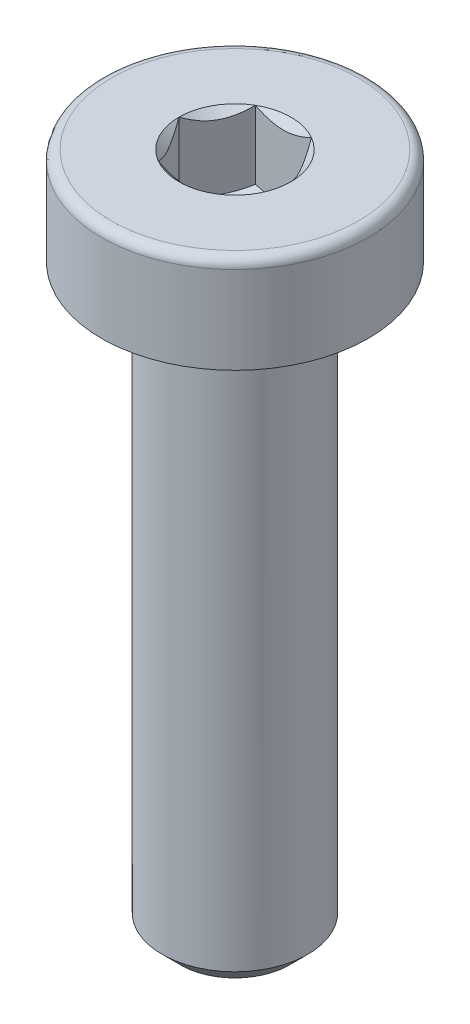
ISO-10303-21;
HEADER;
FILE_DESCRIPTION(('STEP AP214'),'2;1');
FILE_NAME('part.step','',(''),(''),'','','');
FILE_SCHEMA(('AUTOMOTIVE_DESIGN { 1 0 10303 214 1 1 1 1 }'));
ENDSEC;
DATA;
#1=APPLICATION_CONTEXT('core data for automotive mechanical design processes');
#2=APPLICATION_PROTOCOL_DEFINITION('international standard','automotive_design',2000,#1);
#3=PRODUCT_CONTEXT('',#1,'mechanical');
#4=PRODUCT('Part','Part','',(#3));
#5=PRODUCT_RELATED_PRODUCT_CATEGORY('part','',(#4));
#6=PRODUCT_DEFINITION_FORMATION('','',#4);
#7=PRODUCT_DEFINITION_CONTEXT('part definition',#1,'design');
#8=PRODUCT_DEFINITION('design','',#6,#7);
#9=PRODUCT_DEFINITION_SHAPE('','',#8);
#10=(LENGTH_UNIT() NAMED_UNIT(*) SI_UNIT(.MILLI.,.METRE.));
#11=(NAMED_UNIT(*) PLANE_ANGLE_UNIT() SI_UNIT($,.RADIAN.));
#12=(NAMED_UNIT(*) SI_UNIT($,.STERADIAN.) SOLID_ANGLE_UNIT());
#13=UNCERTAINTY_MEASURE_WITH_UNIT(LENGTH_MEASURE(1.E-05),#10,'distance_accuracy_value','');
#14=(GEOMETRIC_REPRESENTATION_CONTEXT(3) GLOBAL_UNCERTAINTY_ASSIGNED_CONTEXT((#13)) GLOBAL_UNIT_ASSIGNED_CONTEXT((#10,
#11,#12)) REPRESENTATION_CONTEXT('',''));
#15=CARTESIAN_POINT('',(0.,0.,0.));
#16=DIRECTION('',(0.,0.,1.));
#17=DIRECTION('',(1.,0.,0.));
#18=AXIS2_PLACEMENT_3D('',#15,#16,#17);
#19=CARTESIAN_POINT('',(0.,-0.2,0.));
#20=DIRECTION('',(0.,1.,0.));
#21=DIRECTION('',(0.,0.,-1.));
#22=AXIS2_PLACEMENT_3D('',#19,#20,#21);
#23=TOROIDAL_SURFACE('',#22,1.7,0.2);
#24=CARTESIAN_POINT('',(0.,0.,0.));
#25=DIRECTION('',(0.,-1.,0.));
#26=DIRECTION('',(0.,0.,-1.));
#27=AXIS2_PLACEMENT_3D('',#24,#25,#26);
#28=CIRCLE('',#27,1.7);
#29=CARTESIAN_POINT('',(0.,0.,-1.7));
#30=VERTEX_POINT('',#29);
#31=EDGE_CURVE('E290',#30,#30,#28,.T.);
#32=ORIENTED_EDGE('',*,*,#31,.T.);
#33=EDGE_LOOP('',(#32));
#34=FACE_BOUND('',#33,.T.);
#35=CARTESIAN_POINT('',(0.,-0.2,0.));
#36=DIRECTION('',(0.,1.,0.));
#37=DIRECTION('',(0.,0.,-1.));
#38=AXIS2_PLACEMENT_3D('',#35,#36,#37);
#39=CIRCLE('',#38,1.5);
#40=CARTESIAN_POINT('',(0.,-0.2,-1.5));
#41=VERTEX_POINT('',#40);
#42=EDGE_CURVE('E300',#41,#41,#39,.T.);
#43=ORIENTED_EDGE('',*,*,#42,.T.);
#44=EDGE_LOOP('',(#43));
#45=FACE_BOUND('',#44,.T.);
#46=ADVANCED_FACE('F41',(#34,#45),#23,.F.);
#47=CARTESIAN_POINT('',(0.,-12.,0.));
#48=DIRECTION('',(0.,1.,0.));
#49=DIRECTION('',(1.,0.,0.));
#50=AXIS2_PLACEMENT_3D('',#47,#48,#49);
#51=PLANE('',#50);
#52=CARTESIAN_POINT('',(0.,-12.,0.));
#53=DIRECTION('',(0.,1.,0.));
#54=DIRECTION('',(0.,0.,-1.));
#55=AXIS2_PLACEMENT_3D('',#52,#53,#54);
#56=CIRCLE('',#55,1.125);
#57=CARTESIAN_POINT('',(0.,-12.,-1.125));
#58=VERTEX_POINT('',#57);
#59=EDGE_CURVE('E11',#58,#58,#56,.T.);
#60=ORIENTED_EDGE('',*,*,#59,.F.);
#61=EDGE_LOOP('',(#60));
#62=FACE_BOUND('',#61,.T.);
#63=ADVANCED_FACE('F316',(#62),#51,.F.);
#64=CARTESIAN_POINT('',(0.,-12.125,0.));
#65=DIRECTION('',(0.,1.,0.));
#66=DIRECTION('',(-1.,0.,0.));
#67=AXIS2_PLACEMENT_3D('',#64,#65,#66);
#68=CONICAL_SURFACE('',#67,1.,0.785398163397448);
#69=ORIENTED_EDGE('',*,*,#59,.T.);
#70=EDGE_LOOP('',(#69));
#71=FACE_BOUND('',#70,.T.);
#72=CARTESIAN_POINT('',(0.,-11.625,0.));
#73=DIRECTION('',(0.,1.,0.));
#74=DIRECTION('',(-1.,0.,0.));
#75=AXIS2_PLACEMENT_3D('',#72,#73,#74);
#76=CIRCLE('',#75,1.5);
#77=CARTESIAN_POINT('',(-1.5,-11.625,0.));
#78=VERTEX_POINT('',#77);
#79=EDGE_CURVE('E133',#78,#78,#76,.T.);
#80=ORIENTED_EDGE('',*,*,#79,.F.);
#81=EDGE_LOOP('',(#80));
#82=FACE_BOUND('',#81,.T.);
#83=ADVANCED_FACE('F271',(#71,#82),#68,.T.);
#84=CARTESIAN_POINT('',(-1.15470053837925,0.5,0.));
#85=DIRECTION('',(-0.866025403784439,0.,-0.5));
#86=DIRECTION('',(0.,1.,0.));
#87=AXIS2_PLACEMENT_3D('',#84,#85,#86);
#88=PLANE('',#87);
#89=CARTESIAN_POINT('',(-1.15470053837925,2.,0.));
#90=CARTESIAN_POINT('',(-1.13811290051949,1.98342266199646,-0.0287348170953944));
#91=CARTESIAN_POINT('',(-1.12123555069305,1.96760439479917,-0.0577616138982867));
#92=CARTESIAN_POINT('',(-1.09593470093621,1.94579754194468,-0.101183953998303));
#93=CARTESIAN_POINT('',(-1.08770744910027,1.93899563963594,-0.115289976780325));
#94=CARTESIAN_POINT('',(-1.07137905760404,1.92611876946348,-0.143289328742409));
#95=CARTESIAN_POINT('',(-1.06328091933733,1.92002869586461,-0.157177412131507));
#96=CARTESIAN_POINT('',(-1.04720018701061,1.90857633773861,-0.184787164277924));
#97=CARTESIAN_POINT('',(-1.03921987610035,1.90319950581573,-0.198504111998951));
#98=CARTESIAN_POINT('',(-1.02335869013404,1.89317259824657,-0.225819419170297));
#99=CARTESIAN_POINT('',(-1.01547945146266,1.88850921181502,-0.239413822772958));
#100=CARTESIAN_POINT('',(-0.999798885932428,1.87990783588392,-0.266532275213475));
#101=CARTESIAN_POINT('',(-0.991998636338617,1.87595850190746,-0.280053335251351));
#102=CARTESIAN_POINT('',(-0.976448412405247,1.86878294697385,-0.307073372510779));
#103=CARTESIAN_POINT('',(-0.968699070566479,1.86554812543175,-0.320570421372709));
#104=CARTESIAN_POINT('',(-0.953216804871379,1.85979880306902,-0.347590357134202));
#105=CARTESIAN_POINT('',(-0.945484180860458,1.85727916970106,-0.361112320660297));
#106=CARTESIAN_POINT('',(-0.929993904585942,1.85295579242638,-0.388228510454098));
#107=CARTESIAN_POINT('',(-0.922236308144873,1.85115096744245,-0.401822595841889));
#108=CARTESIAN_POINT('',(-0.90665050966111,1.8482557150365,-0.429129644754855));
#109=CARTESIAN_POINT('',(-0.898822146976691,1.84716860492423,-0.442842867527506));
#110=CARTESIAN_POINT('',(-0.883030995902152,1.8456940799998,-0.470425755688464));
#111=CARTESIAN_POINT('',(-0.875067667178854,1.84531431420474,-0.484295517782133));
#112=CARTESIAN_POINT('',(-0.858942744760318,1.84528887087763,-0.51231125005588));
#113=CARTESIAN_POINT('',(-0.85078050857397,1.84565882739202,-0.52645688326507));
#114=CARTESIAN_POINT('',(-0.834496812685205,1.847210942197,-0.554713266474792));
#115=CARTESIAN_POINT('',(-0.826375327173013,1.84839249628394,-0.56882403459356));
#116=CARTESIAN_POINT('',(-0.810129363846157,1.85155142789717,-0.597074648783628));
#117=CARTESIAN_POINT('',(-0.802005196148906,1.85353382402747,-0.61121410805965));
#118=CARTESIAN_POINT('',(-0.785713974285288,1.85829144566636,-0.639587165283902));
#119=CARTESIAN_POINT('',(-0.777547766927851,1.86107677968836,-0.653819546505297));
#120=CARTESIAN_POINT('',(-0.761124224940597,1.86743549154836,-0.682436198086551));
#121=CARTESIAN_POINT('',(-0.752868210738168,1.87102315380283,-0.696818032238172));
#122=CARTESIAN_POINT('',(-0.736207806345465,1.87897968869029,-0.725784259598186));
#123=CARTESIAN_POINT('',(-0.727804874211313,1.88336586622526,-0.740364713591029));
#124=CARTESIAN_POINT('',(-0.711592080268563,1.8924866846744,-0.768416307208119));
#125=CARTESIAN_POINT('',(-0.703778742074904,1.89718094197276,-0.781898624581838));
#126=CARTESIAN_POINT('',(-0.688135072813054,1.90717702575227,-0.808872655482011));
#127=CARTESIAN_POINT('',(-0.680305730171417,1.91248565807263,-0.822362416598757));
#128=CARTESIAN_POINT('',(-0.664615689697741,1.92370585705,-0.84938935749767));
#129=CARTESIAN_POINT('',(-0.656756414542127,1.92962555083964,-0.862923982797114));
#130=CARTESIAN_POINT('',(-0.64099605532617,1.94206708289181,-0.890075839755966));
#131=CARTESIAN_POINT('',(-0.633096875640915,1.94859801630983,-0.903689987556145));
#132=CARTESIAN_POINT('',(-0.609052537896968,1.96932150291984,-0.945159941867087));
#133=CARTESIAN_POINT('',(-0.593083085982219,1.98426742536512,-0.972744659363466));
#134=CARTESIAN_POINT('',(-0.577350269189265,1.9999999999997,-0.999999999999873));
#135=B_SPLINE_CURVE_WITH_KNOTS('',3,(#89,#90,#91,#92,#93,#94,#95,#96,#97,#98,#99,#100,#101,#102,
#103,#104,#105,#106,#107,#108,#109,#110,#111,#112,#113,#114,#115,#116,#117,#118,#119,#120,#121,
#122,#123,#124,#125,#126,#127,#128,#129,#130,#131,#132,#133,#134),.UNSPECIFIED.,.F.,.F.,(4,2,2,
2,2,2,2,2,2,2,2,2,2,2,2,2,2,2,2,2,2,2,4),(0.,0.111272550174337,0.164335445361573,
0.215899595557141,0.266155171285321,0.315312848542686,0.363603421261408,0.411276511431237,
0.458598287135888,0.505848217490368,0.553315037999811,0.601292236029578,0.650280199235592,
0.699231732228985,0.748494907961426,0.798407597789335,0.849291872516503,0.90144968589758,
0.950262743745297,0.999680464451618,1.0498706012499,1.10098683352,1.20653128166088),.UNSPECIFIED.);
#136=CARTESIAN_POINT('',(-1.15470053837925,2.,0.));
#137=VERTEX_POINT('',#136);
#138=CARTESIAN_POINT('',(-0.577350269189626,2.,-1.));
#139=VERTEX_POINT('',#138);
#140=EDGE_CURVE('E149',#137,#139,#135,.T.);
#141=ORIENTED_EDGE('',*,*,#140,.F.);
#142=DIRECTION('',(0.,1.,0.));
#143=VECTOR('',#142,1.);
#144=CARTESIAN_POINT('',(-1.15470053837925,0.5,0.));
#145=LINE('',#144,#143);
#146=CARTESIAN_POINT('',(-1.15470053837925,0.589316397477044,0.));
#147=VERTEX_POINT('',#146);
#148=EDGE_CURVE('E53',#147,#137,#145,.T.);
#149=ORIENTED_EDGE('',*,*,#148,.F.);
#150=CARTESIAN_POINT('',(-1.15470053837925,0.589316397477044,0.));
#151=CARTESIAN_POINT('',(-0.866025403784419,0.422649730810363,-0.500000000000031));
#152=CARTESIAN_POINT('',(-0.577350269189623,0.589316397477023,-1.));
#153=B_SPLINE_CURVE_WITH_KNOTS('',2,(#150,#151,#152),.UNSPECIFIED.,.F.,.F.,(3,3),(0.,1.),.UNSPECIFIED.);
#154=CARTESIAN_POINT('',(-0.577350269189626,0.589316397477042,-1.));
#155=VERTEX_POINT('',#154);
#156=EDGE_CURVE('E132',#147,#155,#153,.T.);
#157=ORIENTED_EDGE('',*,*,#156,.T.);
#158=DIRECTION('',(0.,1.,0.));
#159=VECTOR('',#158,1.);
#160=CARTESIAN_POINT('',(-0.577350269189626,0.5,-1.));
#161=LINE('',#160,#159);
#162=EDGE_CURVE('E176',#155,#139,#161,.T.);
#163=ORIENTED_EDGE('',*,*,#162,.T.);
#164=EDGE_LOOP('',(#141,#149,#157,#163));
#165=FACE_BOUND('',#164,.T.);
#166=ADVANCED_FACE('F147',(#165),#88,.F.);
#167=CARTESIAN_POINT('',(-0.577350269189624,0.5,1.));
#168=DIRECTION('',(-0.866025403784438,0.,0.5));
#169=DIRECTION('',(-0.5,0.,-0.866025403784438));
#170=AXIS2_PLACEMENT_3D('',#167,#168,#169);
#171=PLANE('',#170);
#172=CARTESIAN_POINT('',(-0.577350269189628,2.00000000000001,1.));
#173=CARTESIAN_POINT('',(-0.593941531837459,1.98342266199647,0.971267275676974));
#174=CARTESIAN_POINT('',(-0.61064080034603,1.96760439479918,0.942137663577272));
#175=CARTESIAN_POINT('',(-0.635595225085994,1.94579754194469,0.898515314900514));
#176=CARTESIAN_POINT('',(-0.643697773243615,1.93899563963595,0.884337294416245));
#177=CARTESIAN_POINT('',(-0.659781727584165,1.92611876946349,0.856196816596529));
#178=CARTESIAN_POINT('',(-0.667760091475645,1.92002869586462,0.842239581439652));
#179=CARTESIAN_POINT('',(-0.683630472063271,1.90857633773862,0.814508382660042));
#180=CARTESIAN_POINT('',(-0.691519541796937,1.90319950581574,0.800738756821153));
#181=CARTESIAN_POINT('',(-0.70724469873634,1.89317259824658,0.773344913254501));
#182=CARTESIAN_POINT('',(-0.715078178269854,1.88850921181503,0.759724090601278));
#183=CARTESIAN_POINT('',(-0.730723164229545,1.87990783588393,0.732585096286131));
#184=CARTESIAN_POINT('',(-0.738532620911535,1.87595850190747,0.719069351963093));
#185=CARTESIAN_POINT('',(-0.754157547622717,1.86878294697386,0.692092444372544));
#186=CARTESIAN_POINT('',(-0.761971663893885,1.86554812543175,0.678632793046597));
#187=CARTESIAN_POINT('',(-0.77763048182441,1.85979880306903,0.651714789765753));
#188=CARTESIAN_POINT('',(-0.785474533741595,1.85727916970106,0.638257159171334));
#189=CARTESIAN_POINT('',(-0.80121270481961,1.85295579242638,0.611284091509063));
#190=CARTESIAN_POINT('',(-0.809106729886117,1.85115096744246,0.597768773224894));
#191=CARTESIAN_POINT('',(-0.824962428705249,1.84825571503651,0.570617551343206));
#192=CARTESIAN_POINT('',(-0.83292424665191,1.84716860492424,0.556981379002135));
#193=CARTESIAN_POINT('',(-0.848916152971775,1.84569407999981,0.529514396936106));
#194=CARTESIAN_POINT('',(-0.856946054927689,1.84531431420475,0.515683070916208));
#195=CARTESIAN_POINT('',(-0.873145929573069,1.84528887087764,0.487710612330905));
#196=CARTESIAN_POINT('',(-0.881315289191631,1.84565882739203,0.47356909183732));
#197=CARTESIAN_POINT('',(-0.897644186925879,1.84721094219701,0.445338805925414));
#198=CARTESIAN_POINT('',(-0.90580372782753,1.84839249628395,0.431250009096055));
#199=CARTESIAN_POINT('',(-0.922146495725198,1.85155142789717,0.403055285051083));
#200=CARTESIAN_POINT('',(-0.930329542805383,1.85353382402748,0.388949819802669));
#201=CARTESIAN_POINT('',(-0.946755720212819,1.85829144566637,0.360654679197969));
#202=CARTESIAN_POINT('',(-0.954998220228186,1.86107677968837,0.346466345563147));
#203=CARTESIAN_POINT('',(-0.971569196475207,1.86743549154837,0.31793481519138));
#204=CARTESIAN_POINT('',(-0.979896223102333,1.87102315380284,0.303593980082215));
#205=CARTESIAN_POINT('',(-0.996651509651594,1.8789796886903,0.274682532960673));
#206=CARTESIAN_POINT('',(-1.00507708714105,1.88336586622527,0.260115153269712));
#207=CARTESIAN_POINT('',(-1.02126408285868,1.89248668467436,0.232048665040395));
#208=CARTESIAN_POINT('',(-1.02903344310931,1.89718094197267,0.218540956989525));
#209=CARTESIAN_POINT('',(-1.04457180448032,1.90717702575211,0.191506126550374));
#210=CARTESIAN_POINT('',(-1.05233960897755,1.91248565807245,0.177980836369454));
#211=CARTESIAN_POINT('',(-1.06790060614572,1.92370585704978,0.150879392283449));
#212=CARTESIAN_POINT('',(-1.07569229790793,1.92962555083941,0.137305747693652));
#213=CARTESIAN_POINT('',(-1.09132631618625,1.94206708289158,0.11008094776045));
#214=CARTESIAN_POINT('',(-1.09916692418947,1.94859801630961,0.0964329835838638));
#215=CARTESIAN_POINT('',(-1.12305878924465,1.9693215029197,0.0548749991248427));
#216=CARTESIAN_POINT('',(-1.13896312939544,1.98426742536505,0.0272526893338586));
#217=CARTESIAN_POINT('',(-1.15470053837896,1.99999999999971,-2.5048082669767E-13));
#218=B_SPLINE_CURVE_WITH_KNOTS('',3,(#172,#173,#174,#175,#176,#177,#178,#179,#180,#181,#182,
#183,#184,#185,#186,#187,#188,#189,#190,#191,#192,#193,#194,#195,#196,#197,#198,#199,#200,#201,
#202,#203,#204,#205,#206,#207,#208,#209,#210,#211,#212,#213,#214,#215,#216,#217),.UNSPECIFIED.,
.F.,.F.,(4,2,2,2,2,2,2,2,2,2,2,2,2,2,2,2,2,2,2,2,2,2,4),(0.,0.111272550174332,0.164335445361567,
0.215899595557133,0.266155171285313,0.315312848542677,0.3636034212614,0.411276511431228,
0.45859828713588,0.505848217490361,0.553315037999805,0.601292236029574,0.65028019923533,
0.699231732228569,0.748494907960958,0.798407597788917,0.849291872516234,0.901449685897562,
0.950262743745008,0.999680464451159,1.04987060124937,1.10098683351952,1.20653128166087),.UNSPECIFIED.);
#219=CARTESIAN_POINT('',(-0.577350269189625,2.,1.));
#220=VERTEX_POINT('',#219);
#221=EDGE_CURVE('E173',#220,#137,#218,.T.);
#222=ORIENTED_EDGE('',*,*,#221,.F.);
#223=DIRECTION('',(0.,1.,0.));
#224=VECTOR('',#223,1.);
#225=CARTESIAN_POINT('',(-0.577350269189625,0.5,1.));
#226=LINE('',#225,#224);
#227=CARTESIAN_POINT('',(-0.577350269189625,0.589316397477047,1.));
#228=VERTEX_POINT('',#227);
#229=EDGE_CURVE('E128',#228,#220,#226,.T.);
#230=ORIENTED_EDGE('',*,*,#229,.F.);
#231=CARTESIAN_POINT('',(-0.577350269189624,0.589316397477046,1.));
#232=CARTESIAN_POINT('',(-0.866025403784455,0.422649730810367,0.499999999999969));
#233=CARTESIAN_POINT('',(-1.15470053837925,0.589316397477025,0.));
#234=B_SPLINE_CURVE_WITH_KNOTS('',2,(#231,#232,#233),.UNSPECIFIED.,.F.,.F.,(3,3),(0.,1.),.UNSPECIFIED.);
#235=EDGE_CURVE('E122',#228,#147,#234,.T.);
#236=ORIENTED_EDGE('',*,*,#235,.T.);
#237=ORIENTED_EDGE('',*,*,#148,.T.);
#238=EDGE_LOOP('',(#222,#230,#236,#237));
#239=FACE_BOUND('',#238,.T.);
#240=ADVANCED_FACE('F43',(#239),#171,.F.);
#241=CARTESIAN_POINT('',(0.577350269189628,0.5,1.));
#242=DIRECTION('',(0.,0.,1.));
#243=DIRECTION('',(0.,-1.,0.));
#244=AXIS2_PLACEMENT_3D('',#241,#242,#243);
#245=PLANE('',#244);
#246=CARTESIAN_POINT('',(0.577350269189624,2.00000000000001,1.));
#247=CARTESIAN_POINT('',(0.553800025915533,1.98822603681754,0.999998167957607));
#248=CARTESIAN_POINT('',(0.53002319662689,1.97688905054343,1.00001417378921));
#249=CARTESIAN_POINT('',(0.482781582166339,1.9556075877741,1.00006888120379));
#250=CARTESIAN_POINT('',(0.459331734859619,1.94562984801314,1.00010682894213));
#251=CARTESIAN_POINT('',(0.412637184989049,1.92706153398431,1.00019267101419));
#252=CARTESIAN_POINT('',(0.389404800641485,1.91844018503403,1.00024026062339));
#253=CARTESIAN_POINT('',(0.343025384343104,1.90258770334269,1.00032811834732));
#254=CARTESIAN_POINT('',(0.319887287423713,1.89533063168831,1.0003685220543));
#255=CARTESIAN_POINT('',(0.28396905815587,1.88513189438625,1.00037952108944));
#256=CARTESIAN_POINT('',(0.271315561221434,1.88173971858613,1.00037366472534));
#257=CARTESIAN_POINT('',(0.246157653172697,1.87541237483904,1.00034209137255));
#258=CARTESIAN_POINT('',(0.233655177580738,1.87246955581885,1.00031676570706));
#259=CARTESIAN_POINT('',(0.208770103174207,1.86704337026022,1.00026027717205));
#260=CARTESIAN_POINT('',(0.196389006729885,1.86455313042386,1.0002292192388));
#261=CARTESIAN_POINT('',(0.171716988877537,1.86003037325887,1.00016856051116));
#262=CARTESIAN_POINT('',(0.159427126425281,1.85799209889465,1.00013894565578));
#263=CARTESIAN_POINT('',(0.134906807402543,1.85437228307887,1.00008682181391));
#264=CARTESIAN_POINT('',(0.122677002769373,1.85278634040735,1.00006424413959));
#265=CARTESIAN_POINT('',(0.0982452716357383,1.85006970506283,1.00002877386777));
#266=CARTESIAN_POINT('',(0.0860436599187247,1.84893619003586,1.00001582077837));
#267=CARTESIAN_POINT('',(0.0616361034369748,1.84712271030556,0.999999281194874));
#268=CARTESIAN_POINT('',(0.049430239160526,1.84644166498135,0.99999567232403));
#269=CARTESIAN_POINT('',(0.0249814925742225,1.84553156126019,0.999994826477444));
#270=CARTESIAN_POINT('',(0.0127385824285995,1.84530325235072,0.999997600051223));
#271=CARTESIAN_POINT('',(-0.0117699093089312,1.84529590976491,1.00000240436833));
#272=CARTESIAN_POINT('',(-0.0240354911326579,1.84551770421206,1.00000443373431));
#273=CARTESIAN_POINT('',(-0.0485276608234832,1.84641485939752,1.00001329857417));
#274=CARTESIAN_POINT('',(-0.0607542789969373,1.84708939120195,1.00002012526552));
#275=CARTESIAN_POINT('',(-0.0852014626157827,1.84889040013758,1.00004221085803));
#276=CARTESIAN_POINT('',(-0.0974219540555072,1.8500178795742,1.00005748848831));
#277=CARTESIAN_POINT('',(-0.121889608631145,1.8527228717761,1.00009680071916));
#278=CARTESIAN_POINT('',(-0.13413646702124,1.85430313264586,1.00012088904999));
#279=CARTESIAN_POINT('',(-0.158689106182079,1.85791203563793,1.00017544918413));
#280=CARTESIAN_POINT('',(-0.170994247777745,1.85994501185442,1.00020598253097));
#281=CARTESIAN_POINT('',(-0.195695079239052,1.864457628014,1.00026809188207));
#282=CARTESIAN_POINT('',(-0.208089724420771,1.86694296685528,1.00029967641919));
#283=CARTESIAN_POINT('',(-0.233000226311658,1.87235971612185,1.00035691387752));
#284=CARTESIAN_POINT('',(-0.24551459573445,1.87529795011875,1.00038245763407));
#285=CARTESIAN_POINT('',(-0.270694579941495,1.88161679535159,1.00041468917582));
#286=CARTESIAN_POINT('',(-0.283358271723342,1.88500502464959,1.00042099293427));
#287=CARTESIAN_POINT('',(-0.319355980941363,1.89520675220563,1.00040981931455));
#288=CARTESIAN_POINT('',(-0.342562828838121,1.9024735224621,1.00036742345573));
#289=CARTESIAN_POINT('',(-0.389067231423858,1.91834639861325,1.00027227006806));
#290=CARTESIAN_POINT('',(-0.412356054143943,1.92697788991275,1.00021930978689));
#291=CARTESIAN_POINT('',(-0.459150817788463,1.94556797492265,1.00012281198921));
#292=CARTESIAN_POINT('',(-0.482644619058579,1.95555692973842,1.00007957938085));
#293=CARTESIAN_POINT('',(-0.529961603825126,1.97686192522768,1.00001682251946));
#294=CARTESIAN_POINT('',(-0.553769993135023,1.98821092489576,0.999998129439885));
#295=CARTESIAN_POINT('',(-0.577350269189629,2.,0.99999999999999));
#296=B_SPLINE_CURVE_WITH_KNOTS('',3,(#246,#247,#248,#249,#250,#251,#252,#253,#254,#255,#256,
#257,#258,#259,#260,#261,#262,#263,#264,#265,#266,#267,#268,#269,#270,#271,#272,#273,#274,#275,
#276,#277,#278,#279,#280,#281,#282,#283,#284,#285,#286,#287,#288,#289,#290,#291,#292,#293,#294,
#295),.UNSPECIFIED.,.F.,.F.,(4,2,2,2,2,2,2,2,2,2,2,2,2,2,2,2,2,2,2,2,2,2,2,2,4),(0.,
0.0789945069839851,0.155423933765288,0.229735714121901,0.302447276968801,0.341742966594387,
0.380268841749468,0.418149076076723,0.455514857491566,0.492503591404803,0.52925783231042,
0.565923975475662,0.602650767505618,0.639445192650885,0.676172432608918,0.712981396109526,
0.75001867970216,0.787427074463517,0.825344251186806,0.863901683628061,0.903223842479998,
0.976140734734358,1.05062170245461,1.12718543062468,1.20628071173709),.UNSPECIFIED.);
#297=CARTESIAN_POINT('',(0.577350269189628,2.,1.));
#298=VERTEX_POINT('',#297);
#299=EDGE_CURVE('E391',#298,#220,#296,.T.);
#300=ORIENTED_EDGE('',*,*,#299,.F.);
#301=DIRECTION('',(0.,1.,0.));
#302=VECTOR('',#301,1.);
#303=CARTESIAN_POINT('',(0.577350269189628,0.5,1.));
#304=LINE('',#303,#302);
#305=CARTESIAN_POINT('',(0.577350269189628,0.589316397477047,1.));
#306=VERTEX_POINT('',#305);
#307=EDGE_CURVE('E152',#306,#298,#304,.T.);
#308=ORIENTED_EDGE('',*,*,#307,.F.);
#309=CARTESIAN_POINT('',(0.577350269189629,0.589316397477046,1.));
#310=CARTESIAN_POINT('',(0.,0.422649730810369,1.));
#311=CARTESIAN_POINT('',(-0.577350269189626,0.589316397477027,1.));
#312=B_SPLINE_CURVE_WITH_KNOTS('',2,(#309,#310,#311),.UNSPECIFIED.,.F.,.F.,(3,3),(0.,1.),.UNSPECIFIED.);
#313=EDGE_CURVE('E368',#306,#228,#312,.T.);
#314=ORIENTED_EDGE('',*,*,#313,.T.);
#315=ORIENTED_EDGE('',*,*,#229,.T.);
#316=EDGE_LOOP('',(#300,#308,#314,#315));
#317=FACE_BOUND('',#316,.T.);
#318=ADVANCED_FACE('F224',(#317),#245,.F.);
#319=CARTESIAN_POINT('',(1.15470053837925,0.5,0.));
#320=DIRECTION('',(0.866025403784439,0.,0.5));
#321=DIRECTION('',(0.,-1.,0.));
#322=AXIS2_PLACEMENT_3D('',#319,#320,#321);
#323=PLANE('',#322);
#324=CARTESIAN_POINT('',(1.15470053837925,2.,0.));
#325=CARTESIAN_POINT('',(1.13811290051954,1.98342266199651,0.0287348170953168));
#326=CARTESIAN_POINT('',(1.12123555069315,1.96760439479927,0.0577616138981319));
#327=CARTESIAN_POINT('',(1.0959347009364,1.94579754194485,0.101183953998051));
#328=CARTESIAN_POINT('',(1.08770744910049,1.93899563963613,0.11528997678005));
#329=CARTESIAN_POINT('',(1.0713790576043,1.9261187694637,0.1432893287421));
#330=CARTESIAN_POINT('',(1.06328091933761,1.92002869586484,0.157177412131185));
#331=CARTESIAN_POINT('',(1.04720018701092,1.90857633773886,0.184787164277586));
#332=CARTESIAN_POINT('',(1.03921987610068,1.90319950581599,0.198504111998609));
#333=CARTESIAN_POINT('',(1.02335869013438,1.89317259824684,0.225819419169955));
#334=CARTESIAN_POINT('',(1.01547945146302,1.8885092118153,0.239413822772619));
#335=CARTESIAN_POINT('',(0.999798885932792,1.87990783588419,0.26653227521315));
#336=CARTESIAN_POINT('',(0.991998636338982,1.87595850190773,0.280053335251036));
#337=CARTESIAN_POINT('',(0.976448412405607,1.86878294697411,0.307073372510489));
#338=CARTESIAN_POINT('',(0.968699070566833,1.865548125432,0.320570421372434));
#339=CARTESIAN_POINT('',(0.953216804871711,1.85979880306925,0.34759035713396));
#340=CARTESIAN_POINT('',(0.945484180860775,1.85727916970128,0.361112320660075));
#341=CARTESIAN_POINT('',(0.929993904586221,1.85295579242657,0.388228510453917));
#342=CARTESIAN_POINT('',(0.922236308145128,1.85115096744263,0.401822595841729));
#343=CARTESIAN_POINT('',(0.90665050966131,1.84825571503663,0.429129644754741));
#344=CARTESIAN_POINT('',(0.898822146976858,1.84716860492434,0.442842867527415));
#345=CARTESIAN_POINT('',(0.883030995902241,1.84569407999986,0.470425755688419));
#346=CARTESIAN_POINT('',(0.875067667178897,1.84531431420477,0.48429551778211));
#347=CARTESIAN_POINT('',(0.858942744760382,1.84528887087762,0.512311250055722));
#348=CARTESIAN_POINT('',(0.850780508574103,1.84565882739198,0.526456883264756));
#349=CARTESIAN_POINT('',(0.834496812685462,1.84721094219691,0.554713266474235));
#350=CARTESIAN_POINT('',(0.826375327173327,1.84839249628385,0.568824034592915));
#351=CARTESIAN_POINT('',(0.810129363846558,1.85155142789705,0.597074648782873));
#352=CARTESIAN_POINT('',(0.802005196149339,1.85353382402735,0.611214108058871));
#353=CARTESIAN_POINT('',(0.785713974285749,1.85829144566624,0.639587165283134));
#354=CARTESIAN_POINT('',(0.777547766928309,1.86107677968825,0.653819546504565));
#355=CARTESIAN_POINT('',(0.761124224941007,1.86743549154827,0.682436198085945));
#356=CARTESIAN_POINT('',(0.752868210738532,1.87102315380276,0.696818032237658));
#357=CARTESIAN_POINT('',(0.73620780634568,1.87897968869026,0.725784259597905));
#358=CARTESIAN_POINT('',(0.727804874211422,1.88336586622525,0.74036471359089));
#359=CARTESIAN_POINT('',(0.711592080268588,1.89248668467437,0.768416307208036));
#360=CARTESIAN_POINT('',(0.703778742074949,1.89718094197268,0.781898624581674));
#361=CARTESIAN_POINT('',(0.688135072813142,1.90717702575212,0.808872655481718));
#362=CARTESIAN_POINT('',(0.680305730171529,1.91248565807245,0.822362416598417));
#363=CARTESIAN_POINT('',(0.664615689697889,1.92370585704979,0.849389357497269));
#364=CARTESIAN_POINT('',(0.656756414542289,1.92962555083942,0.862923982796697));
#365=CARTESIAN_POINT('',(0.640996055326348,1.94206708289159,0.890075839755551));
#366=CARTESIAN_POINT('',(0.633096875641094,1.94859801630962,0.903689987555748));
#367=CARTESIAN_POINT('',(0.609052537897095,1.96932150291971,0.945159941866839));
#368=CARTESIAN_POINT('',(0.593083085982296,1.98426742536507,0.972744659363348));
#369=CARTESIAN_POINT('',(0.577350269189271,1.99999999999972,0.999999999999876));
#370=B_SPLINE_CURVE_WITH_KNOTS('',3,(#324,#325,#326,#327,#328,#329,#330,#331,#332,#333,#334,
#335,#336,#337,#338,#339,#340,#341,#342,#343,#344,#345,#346,#347,#348,#349,#350,#351,#352,#353,
#354,#355,#356,#357,#358,#359,#360,#361,#362,#363,#364,#365,#366,#367,#368,#369),.UNSPECIFIED.,
.F.,.F.,(4,2,2,2,2,2,2,2,2,2,2,2,2,2,2,2,2,2,2,2,2,2,4),(0.,0.111272550174011,0.16433544536114,
0.215899595556638,0.266155171284781,0.315312848542141,0.363603421260888,0.411276511430768,
0.458598287135496,0.505848217490074,0.553315037999631,0.601292236029526,0.650280199235029,
0.699231732228109,0.74849490796044,0.798407597788447,0.849291872515925,0.901449685897527,
0.950262743744969,0.999680464451117,1.04987060124933,1.10098683351948,1.20653128166083),.UNSPECIFIED.);
#371=CARTESIAN_POINT('',(1.15470053837925,2.,0.));
#372=VERTEX_POINT('',#371);
#373=EDGE_CURVE('E405',#372,#298,#370,.T.);
#374=ORIENTED_EDGE('',*,*,#373,.F.);
#375=DIRECTION('',(0.,1.,0.));
#376=VECTOR('',#375,1.);
#377=CARTESIAN_POINT('',(1.15470053837925,0.5,0.));
#378=LINE('',#377,#376);
#379=CARTESIAN_POINT('',(1.15470053837925,0.589316397477045,0.));
#380=VERTEX_POINT('',#379);
#381=EDGE_CURVE('E178',#380,#372,#378,.T.);
#382=ORIENTED_EDGE('',*,*,#381,.F.);
#383=CARTESIAN_POINT('',(1.15470053837925,0.589316397477044,0.));
#384=CARTESIAN_POINT('',(0.866025403784422,0.422649730810369,0.500000000000028));
#385=CARTESIAN_POINT('',(0.577350269189625,0.589316397477027,1.));
#386=B_SPLINE_CURVE_WITH_KNOTS('',2,(#383,#384,#385),.UNSPECIFIED.,.F.,.F.,(3,3),(0.,1.),.UNSPECIFIED.);
#387=EDGE_CURVE('E348',#380,#306,#386,.T.);
#388=ORIENTED_EDGE('',*,*,#387,.T.);
#389=ORIENTED_EDGE('',*,*,#307,.T.);
#390=EDGE_LOOP('',(#374,#382,#388,#389));
#391=FACE_BOUND('',#390,.T.);
#392=ADVANCED_FACE('F325',(#391),#323,.F.);
#393=CARTESIAN_POINT('',(0.577350269189626,0.5,-1.));
#394=DIRECTION('',(0.866025403784439,0.,-0.5));
#395=DIRECTION('',(0.,-1.,0.));
#396=AXIS2_PLACEMENT_3D('',#393,#394,#395);
#397=PLANE('',#396);
#398=CARTESIAN_POINT('',(0.577350269189624,1.99999999999999,-0.999999999999998));
#399=CARTESIAN_POINT('',(0.593941531837408,1.9834226619965,-0.971267275677055));
#400=CARTESIAN_POINT('',(0.610640800345942,1.96760439479926,-0.94213766357744));
#401=CARTESIAN_POINT('',(0.635595225085866,1.94579754194484,-0.898515314900803));
#402=CARTESIAN_POINT('',(0.64369777324348,1.93899563963612,-0.884337294416566));
#403=CARTESIAN_POINT('',(0.659781727584023,1.92611876946369,-0.856196816596903));
#404=CARTESIAN_POINT('',(0.667760091475502,1.92002869586483,-0.842239581440049));
#405=CARTESIAN_POINT('',(0.683630472063132,1.90857633773885,-0.814508382660476));
#406=CARTESIAN_POINT('',(0.691519541796802,1.90319950581598,-0.800738756821601));
#407=CARTESIAN_POINT('',(0.707244698736216,1.89317259824683,-0.773344913254968));
#408=CARTESIAN_POINT('',(0.715078178269738,1.88850921181529,-0.75972409060175));
#409=CARTESIAN_POINT('',(0.730723164229445,1.87990783588418,-0.732585096286604));
#410=CARTESIAN_POINT('',(0.738532620911444,1.87595850190772,-0.719069351963562));
#411=CARTESIAN_POINT('',(0.754157547622645,1.8687829469741,-0.692092444372996));
#412=CARTESIAN_POINT('',(0.761971663893822,1.86554812543199,-0.678632793047035));
#413=CARTESIAN_POINT('',(0.777630481824367,1.85979880306924,-0.651714789766157));
#414=CARTESIAN_POINT('',(0.785474533741561,1.85727916970127,-0.638257159171715));
#415=CARTESIAN_POINT('',(0.801212704819592,1.85295579242656,-0.611284091509391));
#416=CARTESIAN_POINT('',(0.809106729886106,1.85115096744262,-0.59776877322519));
#417=CARTESIAN_POINT('',(0.824962428705249,1.84825571503662,-0.570617551343432));
#418=CARTESIAN_POINT('',(0.832924246651914,1.84716860492433,-0.556981379002321));
#419=CARTESIAN_POINT('',(0.848916152971781,1.84569407999985,-0.529514396936204));
#420=CARTESIAN_POINT('',(0.856946054927693,1.84531431420477,-0.515683070916256));
#421=CARTESIAN_POINT('',(0.873145929573076,1.8452888708776,-0.487710612330836));
#422=CARTESIAN_POINT('',(0.881315289191643,1.84565882739196,-0.473569091837184));
#423=CARTESIAN_POINT('',(0.897644186925894,1.8472109421969,-0.445338805925169));
#424=CARTESIAN_POINT('',(0.905803727827543,1.84839249628383,-0.431250009095768));
#425=CARTESIAN_POINT('',(0.922146495725204,1.85155142789704,-0.403055285050741));
#426=CARTESIAN_POINT('',(0.930329542805384,1.85353382402733,-0.388949819802311));
#427=CARTESIAN_POINT('',(0.946755720212809,1.85829144566623,-0.360654679197609));
#428=CARTESIAN_POINT('',(0.954998220228171,1.86107677968823,-0.3464663455628));
#429=CARTESIAN_POINT('',(0.971569196475185,1.86743549154826,-0.317934815191085));
#430=CARTESIAN_POINT('',(0.979896223102309,1.87102315380274,-0.303593980081958));
#431=CARTESIAN_POINT('',(0.996651509651577,1.87897968869024,-0.274682532960527));
#432=CARTESIAN_POINT('',(1.00507708714105,1.88336586622524,-0.260115153269637));
#433=CARTESIAN_POINT('',(1.02126408285878,1.89248668467443,-0.232048665040293));
#434=CARTESIAN_POINT('',(1.02903344310952,1.89718094197282,-0.218540956989325));
#435=CARTESIAN_POINT('',(1.04457180448067,1.90717702575239,-0.191506126550005));
#436=CARTESIAN_POINT('',(1.05233960897795,1.91248565807276,-0.177980836369012));
#437=CARTESIAN_POINT('',(1.06790060614618,1.92370585705016,-0.150879392282903));
#438=CARTESIAN_POINT('',(1.0756922979084,1.9296255508398,-0.137305747693075));
#439=CARTESIAN_POINT('',(1.0913263161867,1.94206708289197,-0.110080947759855));
#440=CARTESIAN_POINT('',(1.0991669241899,1.94859801630999,-0.0964329835832811));
#441=CARTESIAN_POINT('',(1.12305878924491,1.96932150291994,-0.0548749991244581));
#442=CARTESIAN_POINT('',(1.13896312939556,1.98426742536517,-0.027252689333654));
#443=CARTESIAN_POINT('',(1.15470053837897,1.99999999999972,2.51310661974698E-13));
#444=B_SPLINE_CURVE_WITH_KNOTS('',3,(#398,#399,#400,#401,#402,#403,#404,#405,#406,#407,#408,
#409,#410,#411,#412,#413,#414,#415,#416,#417,#418,#419,#420,#421,#422,#423,#424,#425,#426,#427,
#428,#429,#430,#431,#432,#433,#434,#435,#436,#437,#438,#439,#440,#441,#442,#443),.UNSPECIFIED.,
.F.,.F.,(4,2,2,2,2,2,2,2,2,2,2,2,2,2,2,2,2,2,2,2,2,2,4),(0.,0.111272550174011,0.164335445361141,
0.215899595556638,0.266155171284782,0.315312848542142,0.363603421260889,0.411276511430769,
0.458598287135497,0.505848217490076,0.553315037999634,0.601292236029529,0.650280199235466,
0.699231732228805,0.748494907961222,0.798407597789143,0.849291872516367,0.901449685897551,
0.950262743745452,0.999680464451892,1.04987060125021,1.10098683352028,1.20653128166085),.UNSPECIFIED.);
#445=CARTESIAN_POINT('',(0.577350269189626,2.,-1.));
#446=VERTEX_POINT('',#445);
#447=EDGE_CURVE('E185',#446,#372,#444,.T.);
#448=ORIENTED_EDGE('',*,*,#447,.F.);
#449=DIRECTION('',(0.,1.,0.));
#450=VECTOR('',#449,1.);
#451=CARTESIAN_POINT('',(0.577350269189626,0.5,-1.));
#452=LINE('',#451,#450);
#453=CARTESIAN_POINT('',(0.577350269189626,0.589316397477042,-1.));
#454=VERTEX_POINT('',#453);
#455=EDGE_CURVE('E179',#454,#446,#452,.T.);
#456=ORIENTED_EDGE('',*,*,#455,.F.);
#457=CARTESIAN_POINT('',(0.577350269189626,0.589316397477041,-1.));
#458=CARTESIAN_POINT('',(0.866025403784456,0.422649730810364,-0.49999999999997));
#459=CARTESIAN_POINT('',(1.15470053837925,0.589316397477026,0.));
#460=B_SPLINE_CURVE_WITH_KNOTS('',2,(#457,#458,#459),.UNSPECIFIED.,.F.,.F.,(3,3),(0.,1.),.UNSPECIFIED.);
#461=EDGE_CURVE('E346',#454,#380,#460,.T.);
#462=ORIENTED_EDGE('',*,*,#461,.T.);
#463=ORIENTED_EDGE('',*,*,#381,.T.);
#464=EDGE_LOOP('',(#448,#456,#462,#463));
#465=FACE_BOUND('',#464,.T.);
#466=ADVANCED_FACE('F328',(#465),#397,.F.);
#467=CARTESIAN_POINT('',(-0.577350269189626,0.5,-1.));
#468=DIRECTION('',(0.,0.,-1.));
#469=DIRECTION('',(1.,0.,0.));
#470=AXIS2_PLACEMENT_3D('',#467,#468,#469);
#471=PLANE('',#470);
#472=CARTESIAN_POINT('',(-0.57735026918963,2.,-1.));
#473=CARTESIAN_POINT('',(-0.553799018626332,1.98822553857165,-0.999998173354036));
#474=CARTESIAN_POINT('',(-0.530021163519476,1.97688806823107,-1.00001416004713));
#475=CARTESIAN_POINT('',(-0.482777645672904,1.95560580828222,-1.00006882217097));
#476=CARTESIAN_POINT('',(-0.459326924867017,1.94562774621228,-1.00010674385478));
#477=CARTESIAN_POINT('',(-0.41263076310741,1.92705897163753,-1.00019256426333));
#478=CARTESIAN_POINT('',(-0.38939764378498,1.91843747465112,-1.00024015736838));
#479=CARTESIAN_POINT('',(-0.342950204797468,1.90256203937554,-1.00032813390887));
#480=CARTESIAN_POINT('',(-0.319743655589981,1.89528554551412,-1.00036863550711));
#481=CARTESIAN_POINT('',(-0.28379128714849,1.88508381221227,-1.0003795906038));
#482=CARTESIAN_POINT('',(-0.271173414160845,1.88170303933697,-1.00037378374481));
#483=CARTESIAN_POINT('',(-0.246085560922053,1.87539592858828,-1.00034249941035));
#484=CARTESIAN_POINT('',(-0.233617496928954,1.87246201269112,-1.00031740784827));
#485=CARTESIAN_POINT('',(-0.208764412875414,1.86704320231722,-1.00026132520407));
#486=CARTESIAN_POINT('',(-0.19638062679567,1.86455266223854,-1.00023042045424));
#487=CARTESIAN_POINT('',(-0.171702966320913,1.86002941476161,-1.00017003093781));
#488=CARTESIAN_POINT('',(-0.15941014937153,1.85799095773679,-1.00014053259975));
#489=CARTESIAN_POINT('',(-0.134883643999216,1.85437088523129,-1.00008857478594));
#490=CARTESIAN_POINT('',(-0.122650606079548,1.85278487744366,-1.00006604744148));
#491=CARTESIAN_POINT('',(-0.0982121229287101,1.85006821158009,-1.00003057238562));
#492=CARTESIAN_POINT('',(-0.0860069912288732,1.84893474144217,-1.00001756508196));
#493=CARTESIAN_POINT('',(-0.0615206333559041,1.84711617328081,-1.00000075780238));
#494=CARTESIAN_POINT('',(-0.0492392901357822,1.84643264686591,-0.999996989975494));
#495=CARTESIAN_POINT('',(-0.0246386324751404,1.84552292104013,-0.999995628044652));
#496=CARTESIAN_POINT('',(-0.012319289032145,1.84529750750861,-0.999998044533703));
#497=CARTESIAN_POINT('',(0.0121891761432831,1.84530155985422,-1.00000209957335));
#498=CARTESIAN_POINT('',(0.0243782990189907,1.845526246567,-1.00000374607075));
#499=CARTESIAN_POINT('',(0.0487185070377809,1.84642380416033,-1.00001205209129));
#500=CARTESIAN_POINT('',(0.0608696213382497,1.84709588263677,-1.00001870275395));
#501=CARTESIAN_POINT('',(0.0852380225508613,1.848891850074,-1.00004050720725));
#502=CARTESIAN_POINT('',(0.0974550405850347,1.85001938024755,-1.00005572992515));
#503=CARTESIAN_POINT('',(0.121916028787175,1.85272435329628,-1.00009503372606));
#504=CARTESIAN_POINT('',(0.13415969299641,1.85430455429515,-1.00011916938457));
#505=CARTESIAN_POINT('',(0.158706216430161,1.85791321080521,-1.00017388808731));
#506=CARTESIAN_POINT('',(0.171008435091418,1.85994600906713,-1.00020453345274));
#507=CARTESIAN_POINT('',(0.195703679393572,1.86445814400752,-1.00026690229582));
#508=CARTESIAN_POINT('',(0.20809565889068,1.86694318675753,-1.00029863477332));
#509=CARTESIAN_POINT('',(0.233038212021836,1.87236730255237,-1.00035626972392));
#510=CARTESIAN_POINT('',(0.24558702968548,1.8753144316261,-1.00038204351512));
#511=CARTESIAN_POINT('',(0.270837130755103,1.88165350290157,-1.00041455700835));
#512=CARTESIAN_POINT('',(0.283536471910628,1.88505313626283,-1.00042090732892));
#513=CARTESIAN_POINT('',(0.319499881149073,1.89525184723143,-1.00040967732382));
#514=CARTESIAN_POINT('',(0.342638089596974,1.90249917243223,-1.00036738779502));
#515=CARTESIAN_POINT('',(0.389074303524819,1.91834907543261,-1.00027237272484));
#516=CARTESIAN_POINT('',(0.412362412542345,1.92698042722443,-1.00021941755009));
#517=CARTESIAN_POINT('',(0.459155597441506,1.94557006531457,-1.00012289938572));
#518=CARTESIAN_POINT('',(0.482648537268387,1.95555870247411,-1.00007964036235));
#519=CARTESIAN_POINT('',(0.529963632723351,1.9768629062393,-1.00001683713881));
#520=CARTESIAN_POINT('',(0.553770998426698,1.9882114222119,-0.9999981241633));
#521=CARTESIAN_POINT('',(0.577350269189634,1.99999999999999,-0.99999999999999));
#522=B_SPLINE_CURVE_WITH_KNOTS('',3,(#472,#473,#474,#475,#476,#477,#478,#479,#480,#481,#482,
#483,#484,#485,#486,#487,#488,#489,#490,#491,#492,#493,#494,#495,#496,#497,#498,#499,#500,#501,
#502,#503,#504,#505,#506,#507,#508,#509,#510,#511,#512,#513,#514,#515,#516,#517,#518,#519,#520,
#521),.UNSPECIFIED.,.F.,.F.,(4,2,2,2,2,2,2,2,2,2,2,2,2,2,2,2,2,2,2,2,2,2,2,2,4),(0.,
0.0789978972695773,0.15543010410763,0.229744134366991,0.30266870017871,0.341852354194089,
0.380271674271243,0.418159989059979,0.45553460042943,0.492532973314776,0.529297720399875,
0.56619021112632,0.603145936609836,0.639711346045882,0.676212163855028,0.713010761266896,
0.750038523627865,0.787438183603003,0.825347352327571,0.86401143959863,0.903445706239183,
0.97614903621833,1.05062782272799,1.12718880955699,1.20628070690683),.UNSPECIFIED.);
#523=EDGE_CURVE('E186',#139,#446,#522,.T.);
#524=ORIENTED_EDGE('',*,*,#523,.F.);
#525=ORIENTED_EDGE('',*,*,#162,.F.);
#526=CARTESIAN_POINT('',(-0.577350269189627,0.589316397477041,-1.));
#527=CARTESIAN_POINT('',(0.,0.422649730810363,-1.));
#528=CARTESIAN_POINT('',(0.577350269189628,0.589316397477022,-1.));
#529=B_SPLINE_CURVE_WITH_KNOTS('',2,(#526,#527,#528),.UNSPECIFIED.,.F.,.F.,(3,3),(0.,1.),.UNSPECIFIED.);
#530=EDGE_CURVE('E139',#155,#454,#529,.T.);
#531=ORIENTED_EDGE('',*,*,#530,.T.);
#532=ORIENTED_EDGE('',*,*,#455,.T.);
#533=EDGE_LOOP('',(#524,#525,#531,#532));
#534=FACE_BOUND('',#533,.T.);
#535=ADVANCED_FACE('F272',(#534),#471,.F.);
#536=CARTESIAN_POINT('',(0.,2.,0.));
#537=DIRECTION('',(0.,1.,0.));
#538=DIRECTION('',(0.,0.,-1.));
#539=AXIS2_PLACEMENT_3D('',#536,#537,#538);
#540=CONICAL_SURFACE('',#539,1.15470053837925,0.785398163397448);
#541=ORIENTED_EDGE('',*,*,#140,.T.);
#542=CARTESIAN_POINT('',(0.,2.,0.));
#543=DIRECTION('',(0.,1.,0.));
#544=DIRECTION('',(-1.,0.,0.));
#545=AXIS2_PLACEMENT_3D('',#542,#543,#544);
#546=CIRCLE('',#545,1.15470053837925);
#547=EDGE_CURVE('E162',#139,#137,#546,.T.);
#548=ORIENTED_EDGE('',*,*,#547,.T.);
#549=EDGE_LOOP('',(#541,#548));
#550=FACE_BOUND('',#549,.T.);
#551=ADVANCED_FACE('F288',(#550),#540,.F.);
#552=CARTESIAN_POINT('',(0.,1.8,0.));
#553=DIRECTION('',(0.,1.,0.));
#554=DIRECTION('',(0.,0.,-1.));
#555=AXIS2_PLACEMENT_3D('',#552,#553,#554);
#556=TOROIDAL_SURFACE('',#555,2.55,0.2);
#557=CARTESIAN_POINT('',(0.,2.,0.));
#558=DIRECTION('',(0.,-1.,0.));
#559=DIRECTION('',(0.,0.,-1.));
#560=AXIS2_PLACEMENT_3D('',#557,#558,#559);
#561=CIRCLE('',#560,2.55);
#562=CARTESIAN_POINT('',(0.,2.,-2.55));
#563=VERTEX_POINT('',#562);
#564=EDGE_CURVE('E165',#563,#563,#561,.T.);
#565=ORIENTED_EDGE('',*,*,#564,.T.);
#566=EDGE_LOOP('',(#565));
#567=FACE_BOUND('',#566,.T.);
#568=CARTESIAN_POINT('',(0.,1.8,0.));
#569=DIRECTION('',(0.,1.,0.));
#570=DIRECTION('',(0.,0.,-1.));
#571=AXIS2_PLACEMENT_3D('',#568,#569,#570);
#572=CIRCLE('',#571,2.75);
#573=CARTESIAN_POINT('',(0.,1.8,-2.75));
#574=VERTEX_POINT('',#573);
#575=EDGE_CURVE('E172',#574,#574,#572,.T.);
#576=ORIENTED_EDGE('',*,*,#575,.T.);
#577=EDGE_LOOP('',(#576));
#578=FACE_BOUND('',#577,.T.);
#579=ADVANCED_FACE('F520',(#567,#578),#556,.T.);
#580=CARTESIAN_POINT('',(0.,0.,0.));
#581=DIRECTION('',(0.,1.,0.));
#582=DIRECTION('',(1.,0.,0.));
#583=AXIS2_PLACEMENT_3D('',#580,#581,#582);
#584=PLANE('',#583);
#585=CARTESIAN_POINT('',(0.,0.,0.));
#586=DIRECTION('',(0.,-1.,0.));
#587=DIRECTION('',(1.,0.,0.));
#588=AXIS2_PLACEMENT_3D('',#585,#586,#587);
#589=CIRCLE('',#588,2.75);
#590=CARTESIAN_POINT('',(2.75,0.,0.));
#591=VERTEX_POINT('',#590);
#592=EDGE_CURVE('E166',#591,#591,#589,.T.);
#593=ORIENTED_EDGE('',*,*,#592,.T.);
#594=EDGE_LOOP('',(#593));
#595=FACE_BOUND('',#594,.T.);
#596=ORIENTED_EDGE('',*,*,#31,.F.);
#597=EDGE_LOOP('',(#596));
#598=FACE_BOUND('',#597,.T.);
#599=ADVANCED_FACE('F217',(#595,#598),#584,.F.);
#600=CARTESIAN_POINT('',(0.,2.,0.));
#601=DIRECTION('',(0.,1.,0.));
#602=DIRECTION('',(1.,0.,0.));
#603=AXIS2_PLACEMENT_3D('',#600,#601,#602);
#604=PLANE('',#603);
#605=ORIENTED_EDGE('',*,*,#564,.F.);
#606=EDGE_LOOP('',(#605));
#607=FACE_BOUND('',#606,.T.);
#608=CARTESIAN_POINT('',(0.,2.,0.));
#609=DIRECTION('',(0.,1.,0.));
#610=DIRECTION('',(-1.,0.,0.));
#611=AXIS2_PLACEMENT_3D('',#608,#609,#610);
#612=CIRCLE('',#611,1.15470053837925);
#613=EDGE_CURVE('E169',#137,#220,#612,.T.);
#614=ORIENTED_EDGE('',*,*,#613,.F.);
#615=ORIENTED_EDGE('',*,*,#547,.F.);
#616=CARTESIAN_POINT('',(0.,2.,0.));
#617=DIRECTION('',(0.,1.,0.));
#618=DIRECTION('',(-1.,0.,0.));
#619=AXIS2_PLACEMENT_3D('',#616,#617,#618);
#620=CIRCLE('',#619,1.15470053837925);
#621=EDGE_CURVE('E182',#446,#139,#620,.T.);
#622=ORIENTED_EDGE('',*,*,#621,.F.);
#623=CARTESIAN_POINT('',(0.,2.,0.));
#624=DIRECTION('',(0.,1.,0.));
#625=DIRECTION('',(-1.,0.,0.));
#626=AXIS2_PLACEMENT_3D('',#623,#624,#625);
#627=CIRCLE('',#626,1.15470053837925);
#628=EDGE_CURVE('E407',#372,#446,#627,.T.);
#629=ORIENTED_EDGE('',*,*,#628,.F.);
#630=CARTESIAN_POINT('',(0.,2.,0.));
#631=DIRECTION('',(0.,1.,0.));
#632=DIRECTION('',(-1.,0.,0.));
#633=AXIS2_PLACEMENT_3D('',#630,#631,#632);
#634=CIRCLE('',#633,1.15470053837925);
#635=EDGE_CURVE('E104',#298,#372,#634,.T.);
#636=ORIENTED_EDGE('',*,*,#635,.F.);
#637=CARTESIAN_POINT('',(0.,2.,0.));
#638=DIRECTION('',(0.,1.,0.));
#639=DIRECTION('',(-1.,0.,0.));
#640=AXIS2_PLACEMENT_3D('',#637,#638,#639);
#641=CIRCLE('',#640,1.15470053837925);
#642=EDGE_CURVE('E97',#220,#298,#641,.T.);
#643=ORIENTED_EDGE('',*,*,#642,.F.);
#644=EDGE_LOOP('',(#614,#615,#622,#629,#636,#643));
#645=FACE_BOUND('',#644,.T.);
#646=ADVANCED_FACE('F309',(#607,#645),#604,.T.);
#647=CARTESIAN_POINT('',(0.,2.,0.));
#648=DIRECTION('',(0.,-1.,0.));
#649=DIRECTION('',(0.,0.,1.));
#650=AXIS2_PLACEMENT_3D('',#647,#648,#649);
#651=CYLINDRICAL_SURFACE('',#650,2.75);
#652=ORIENTED_EDGE('',*,*,#592,.F.);
#653=EDGE_LOOP('',(#652));
#654=FACE_BOUND('',#653,.T.);
#655=ORIENTED_EDGE('',*,*,#575,.F.);
#656=EDGE_LOOP('',(#655));
#657=FACE_BOUND('',#656,.T.);
#658=ADVANCED_FACE('F216',(#654,#657),#651,.T.);
#659=CARTESIAN_POINT('',(0.,2.,0.));
#660=DIRECTION('',(0.,1.,0.));
#661=DIRECTION('',(0.,0.,-1.));
#662=AXIS2_PLACEMENT_3D('',#659,#660,#661);
#663=CONICAL_SURFACE('',#662,1.15470053837925,0.785398163397448);
#664=ORIENTED_EDGE('',*,*,#221,.T.);
#665=ORIENTED_EDGE('',*,*,#613,.T.);
#666=EDGE_LOOP('',(#664,#665));
#667=FACE_BOUND('',#666,.T.);
#668=ADVANCED_FACE('F205',(#667),#663,.F.);
#669=CARTESIAN_POINT('',(0.,2.,0.));
#670=DIRECTION('',(0.,1.,0.));
#671=DIRECTION('',(0.,0.,-1.));
#672=AXIS2_PLACEMENT_3D('',#669,#670,#671);
#673=CONICAL_SURFACE('',#672,1.15470053837925,0.785398163397448);
#674=ORIENTED_EDGE('',*,*,#299,.T.);
#675=ORIENTED_EDGE('',*,*,#642,.T.);
#676=EDGE_LOOP('',(#674,#675));
#677=FACE_BOUND('',#676,.T.);
#678=ADVANCED_FACE('F215',(#677),#673,.F.);
#679=CARTESIAN_POINT('',(0.,2.,0.));
#680=DIRECTION('',(0.,1.,0.));
#681=DIRECTION('',(0.,0.,-1.));
#682=AXIS2_PLACEMENT_3D('',#679,#680,#681);
#683=CONICAL_SURFACE('',#682,1.15470053837925,0.785398163397448);
#684=ORIENTED_EDGE('',*,*,#373,.T.);
#685=ORIENTED_EDGE('',*,*,#635,.T.);
#686=EDGE_LOOP('',(#684,#685));
#687=FACE_BOUND('',#686,.T.);
#688=ADVANCED_FACE('F439',(#687),#683,.F.);
#689=CARTESIAN_POINT('',(0.,2.,0.));
#690=DIRECTION('',(0.,1.,0.));
#691=DIRECTION('',(0.,0.,-1.));
#692=AXIS2_PLACEMENT_3D('',#689,#690,#691);
#693=CONICAL_SURFACE('',#692,1.15470053837925,0.785398163397448);
#694=ORIENTED_EDGE('',*,*,#447,.T.);
#695=ORIENTED_EDGE('',*,*,#628,.T.);
#696=EDGE_LOOP('',(#694,#695));
#697=FACE_BOUND('',#696,.T.);
#698=ADVANCED_FACE('F443',(#697),#693,.F.);
#699=CARTESIAN_POINT('',(0.,2.,0.));
#700=DIRECTION('',(0.,1.,0.));
#701=DIRECTION('',(0.,0.,-1.));
#702=AXIS2_PLACEMENT_3D('',#699,#700,#701);
#703=CONICAL_SURFACE('',#702,1.15470053837925,0.785398163397448);
#704=ORIENTED_EDGE('',*,*,#523,.T.);
#705=ORIENTED_EDGE('',*,*,#621,.T.);
#706=EDGE_LOOP('',(#704,#705));
#707=FACE_BOUND('',#706,.T.);
#708=ADVANCED_FACE('F222',(#707),#703,.F.);
#709=CARTESIAN_POINT('',(0.,0.5,0.));
#710=DIRECTION('',(0.,1.,0.));
#711=DIRECTION('',(0.,0.,-1.));
#712=AXIS2_PLACEMENT_3D('',#709,#710,#711);
#713=CONICAL_SURFACE('',#712,1.,1.0471975511966);
#714=CARTESIAN_POINT('',(0.,-0.0773502691896258,0.));
#715=VERTEX_POINT('',#714);
#716=VERTEX_LOOP('',#715);
#717=FACE_BOUND('',#716,.T.);
#718=ORIENTED_EDGE('',*,*,#235,.F.);
#719=ORIENTED_EDGE('',*,*,#313,.F.);
#720=ORIENTED_EDGE('',*,*,#387,.F.);
#721=ORIENTED_EDGE('',*,*,#461,.F.);
#722=ORIENTED_EDGE('',*,*,#530,.F.);
#723=ORIENTED_EDGE('',*,*,#156,.F.);
#724=EDGE_LOOP('',(#718,#719,#720,#721,#722,#723));
#725=FACE_BOUND('',#724,.T.);
#726=ADVANCED_FACE('F137',(#717,#725),#713,.F.);
#727=CARTESIAN_POINT('',(0.,-12.,0.));
#728=DIRECTION('',(0.,1.,0.));
#729=DIRECTION('',(0.,0.,-1.));
#730=AXIS2_PLACEMENT_3D('',#727,#728,#729);
#731=CYLINDRICAL_SURFACE('',#730,1.5);
#732=ORIENTED_EDGE('',*,*,#79,.T.);
#733=EDGE_LOOP('',(#732));
#734=FACE_BOUND('',#733,.T.);
#735=ORIENTED_EDGE('',*,*,#42,.F.);
#736=EDGE_LOOP('',(#735));
#737=FACE_BOUND('',#736,.T.);
#738=ADVANCED_FACE('F221',(#734,#737),#731,.T.);
#739=CLOSED_SHELL('',(#46,#63,#83,#166,#240,#318,#392,#466,#535,#551,#579,#599,#646,#658,#668,
#678,#688,#698,#708,#726,#738));
#740=MANIFOLD_SOLID_BREP('B2',#739);
#741=ADVANCED_BREP_SHAPE_REPRESENTATION('',(#18,#740),#14);
#742=SHAPE_DEFINITION_REPRESENTATION(#9,#741);
ENDSEC;
END-ISO-10303-21;
